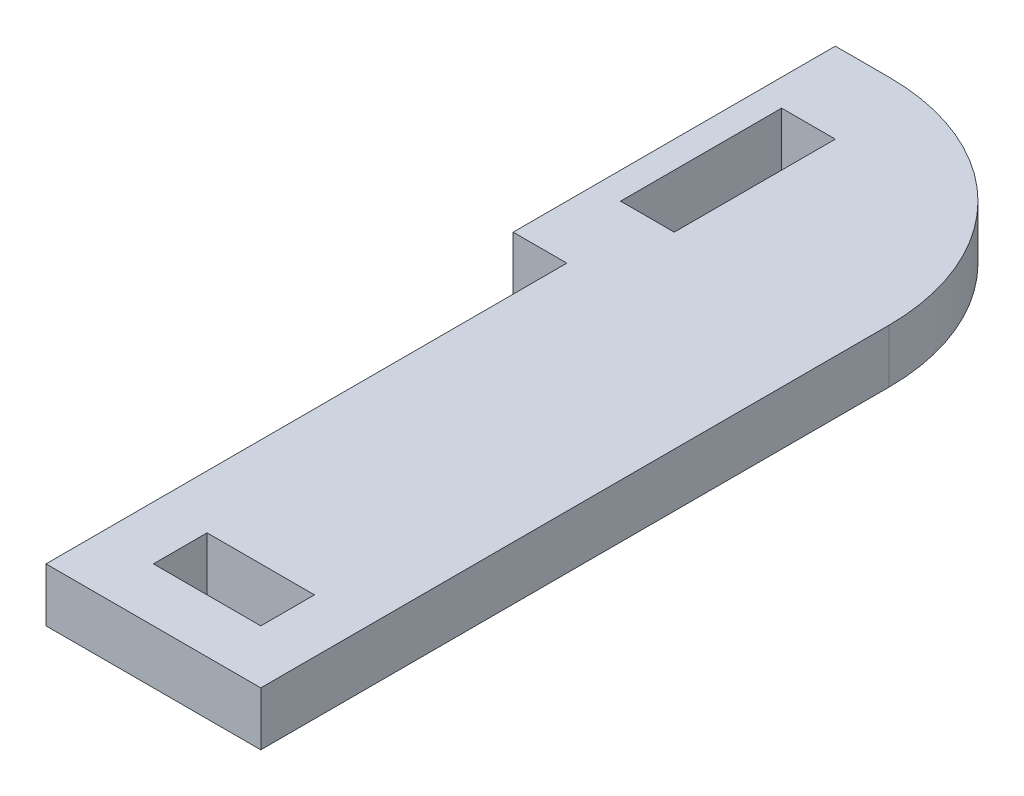
ISO-10303-21;
HEADER;
FILE_DESCRIPTION(('STEP AP214'),'2;1');
FILE_NAME('part.step','',(''),(''),'','','');
FILE_SCHEMA(('AUTOMOTIVE_DESIGN { 1 0 10303 214 1 1 1 1 }'));
ENDSEC;
DATA;
#1=APPLICATION_CONTEXT('core data for automotive mechanical design processes');
#2=APPLICATION_PROTOCOL_DEFINITION('international standard','automotive_design',2000,#1);
#3=PRODUCT_CONTEXT('',#1,'mechanical');
#4=PRODUCT('Part','Part','',(#3));
#5=PRODUCT_RELATED_PRODUCT_CATEGORY('part','',(#4));
#6=PRODUCT_DEFINITION_FORMATION('','',#4);
#7=PRODUCT_DEFINITION_CONTEXT('part definition',#1,'design');
#8=PRODUCT_DEFINITION('design','',#6,#7);
#9=PRODUCT_DEFINITION_SHAPE('','',#8);
#10=(LENGTH_UNIT() NAMED_UNIT(*) SI_UNIT(.MILLI.,.METRE.));
#11=(NAMED_UNIT(*) PLANE_ANGLE_UNIT() SI_UNIT($,.RADIAN.));
#12=(NAMED_UNIT(*) SI_UNIT($,.STERADIAN.) SOLID_ANGLE_UNIT());
#13=UNCERTAINTY_MEASURE_WITH_UNIT(LENGTH_MEASURE(1.E-05),#10,'distance_accuracy_value','');
#14=(GEOMETRIC_REPRESENTATION_CONTEXT(3) GLOBAL_UNCERTAINTY_ASSIGNED_CONTEXT((#13)) GLOBAL_UNIT_ASSIGNED_CONTEXT((#10,
#11,#12)) REPRESENTATION_CONTEXT('',''));
#15=CARTESIAN_POINT('',(0.,0.,0.));
#16=DIRECTION('',(0.,0.,1.));
#17=DIRECTION('',(1.,0.,0.));
#18=AXIS2_PLACEMENT_3D('',#15,#16,#17);
#19=CARTESIAN_POINT('',(0.,5.,0.));
#20=DIRECTION('',(0.,-1.,0.));
#21=DIRECTION('',(0.,0.,-1.));
#22=AXIS2_PLACEMENT_3D('',#19,#20,#21);
#23=PLANE('',#22);
#24=DIRECTION('',(0.,0.,1.));
#25=VECTOR('',#24,1.);
#26=CARTESIAN_POINT('',(-20.0645388891909,5.,-67.5272135511204));
#27=LINE('',#26,#25);
#28=CARTESIAN_POINT('',(-20.0645388891909,5.,-72.5272135511204));
#29=VERTEX_POINT('',#28);
#30=CARTESIAN_POINT('',(-20.0645388891909,5.,-67.5272135511204));
#31=VERTEX_POINT('',#30);
#32=EDGE_CURVE('E201',#29,#31,#27,.T.);
#33=ORIENTED_EDGE('',*,*,#32,.F.);
#34=DIRECTION('',(-1.,0.,0.));
#35=VECTOR('',#34,1.);
#36=CARTESIAN_POINT('',(-20.0645388891909,5.,-72.5272135511204));
#37=LINE('',#36,#35);
#38=CARTESIAN_POINT('',(-10.0645388891909,5.,-72.5272135511204));
#39=VERTEX_POINT('',#38);
#40=EDGE_CURVE('E212',#39,#29,#37,.T.);
#41=ORIENTED_EDGE('',*,*,#40,.F.);
#42=DIRECTION('',(0.,0.,-1.));
#43=VECTOR('',#42,1.);
#44=CARTESIAN_POINT('',(-10.0645388891909,5.,-67.5272135511204));
#45=LINE('',#44,#43);
#46=CARTESIAN_POINT('',(-10.0645388891909,5.,-67.5272135511204));
#47=VERTEX_POINT('',#46);
#48=EDGE_CURVE('E208',#47,#39,#45,.T.);
#49=ORIENTED_EDGE('',*,*,#48,.F.);
#50=DIRECTION('',(1.,0.,0.));
#51=VECTOR('',#50,1.);
#52=CARTESIAN_POINT('',(-20.0645388891909,5.,-67.5272135511204));
#53=LINE('',#52,#51);
#54=EDGE_CURVE('E204',#31,#47,#53,.T.);
#55=ORIENTED_EDGE('',*,*,#54,.F.);
#56=EDGE_LOOP('',(#33,#41,#49,#55));
#57=FACE_BOUND('',#56,.T.);
#58=DIRECTION('',(0.,0.,-1.));
#59=VECTOR('',#58,1.);
#60=CARTESIAN_POINT('',(-5.06453888919091,5.,-141.02721355112));
#61=LINE('',#60,#59);
#62=CARTESIAN_POINT('',(-5.06453888919092,5.,-62.5272135511204));
#63=VERTEX_POINT('',#62);
#64=CARTESIAN_POINT('',(-5.06453888919091,5.,-121.02721355112));
#65=VERTEX_POINT('',#64);
#66=EDGE_CURVE('E252',#63,#65,#61,.T.);
#67=ORIENTED_EDGE('',*,*,#66,.T.);
#68=CARTESIAN_POINT('',(-25.0645388891909,5.,-121.02721355112));
#69=DIRECTION('',(0.,-1.,0.));
#70=DIRECTION('',(0.,0.,-1.));
#71=AXIS2_PLACEMENT_3D('',#68,#69,#70);
#72=CIRCLE('',#71,20.);
#73=CARTESIAN_POINT('',(-25.0645388891909,5.,-141.02721355112));
#74=VERTEX_POINT('',#73);
#75=EDGE_CURVE('E11',#65,#74,#72,.F.);
#76=ORIENTED_EDGE('',*,*,#75,.T.);
#77=DIRECTION('',(-1.,0.,0.));
#78=VECTOR('',#77,1.);
#79=CARTESIAN_POINT('',(-30.0645388891909,5.,-141.02721355112));
#80=LINE('',#79,#78);
#81=CARTESIAN_POINT('',(-30.0645388891909,5.,-141.02721355112));
#82=VERTEX_POINT('',#81);
#83=EDGE_CURVE('E255',#74,#82,#80,.T.);
#84=ORIENTED_EDGE('',*,*,#83,.T.);
#85=DIRECTION('',(0.,0.,1.));
#86=VECTOR('',#85,1.);
#87=CARTESIAN_POINT('',(-30.0645388891909,5.,-111.02721355112));
#88=LINE('',#87,#86);
#89=CARTESIAN_POINT('',(-30.0645388891909,5.,-111.02721355112));
#90=VERTEX_POINT('',#89);
#91=EDGE_CURVE('E258',#82,#90,#88,.T.);
#92=ORIENTED_EDGE('',*,*,#91,.T.);
#93=DIRECTION('',(1.,0.,0.));
#94=VECTOR('',#93,1.);
#95=CARTESIAN_POINT('',(-30.0645388891909,5.,-111.02721355112));
#96=LINE('',#95,#94);
#97=CARTESIAN_POINT('',(-25.0645388891909,5.,-111.02721355112));
#98=VERTEX_POINT('',#97);
#99=EDGE_CURVE('E261',#90,#98,#96,.T.);
#100=ORIENTED_EDGE('',*,*,#99,.T.);
#101=DIRECTION('',(0.,0.,1.));
#102=VECTOR('',#101,1.);
#103=CARTESIAN_POINT('',(-25.0645388891909,5.,-62.5272135511204));
#104=LINE('',#103,#102);
#105=CARTESIAN_POINT('',(-25.0645388891909,5.,-62.5272135511204));
#106=VERTEX_POINT('',#105);
#107=EDGE_CURVE('E244',#98,#106,#104,.T.);
#108=ORIENTED_EDGE('',*,*,#107,.T.);
#109=DIRECTION('',(1.,0.,0.));
#110=VECTOR('',#109,1.);
#111=CARTESIAN_POINT('',(-25.0645388891909,5.,-62.5272135511204));
#112=LINE('',#111,#110);
#113=EDGE_CURVE('E248',#106,#63,#112,.T.);
#114=ORIENTED_EDGE('',*,*,#113,.T.);
#115=EDGE_LOOP('',(#67,#76,#84,#92,#100,#108,#114));
#116=FACE_BOUND('',#115,.T.);
#117=DIRECTION('',(0.,0.,-1.));
#118=VECTOR('',#117,1.);
#119=CARTESIAN_POINT('',(-22.5645388891909,5.,-118.52721355112));
#120=LINE('',#119,#118);
#121=CARTESIAN_POINT('',(-22.5645388891909,5.,-118.52721355112));
#122=VERTEX_POINT('',#121);
#123=CARTESIAN_POINT('',(-22.5645388891909,5.,-133.52721355112));
#124=VERTEX_POINT('',#123);
#125=EDGE_CURVE('E148',#122,#124,#120,.T.);
#126=ORIENTED_EDGE('',*,*,#125,.F.);
#127=DIRECTION('',(1.,0.,0.));
#128=VECTOR('',#127,1.);
#129=CARTESIAN_POINT('',(-27.5645388891909,5.,-118.52721355112));
#130=LINE('',#129,#128);
#131=CARTESIAN_POINT('',(-27.5645388891909,5.,-118.52721355112));
#132=VERTEX_POINT('',#131);
#133=EDGE_CURVE('E177',#132,#122,#130,.T.);
#134=ORIENTED_EDGE('',*,*,#133,.F.);
#135=DIRECTION('',(0.,0.,1.));
#136=VECTOR('',#135,1.);
#137=CARTESIAN_POINT('',(-27.5645388891909,5.,-118.52721355112));
#138=LINE('',#137,#136);
#139=CARTESIAN_POINT('',(-27.5645388891909,5.,-133.52721355112));
#140=VERTEX_POINT('',#139);
#141=EDGE_CURVE('E173',#140,#132,#138,.T.);
#142=ORIENTED_EDGE('',*,*,#141,.F.);
#143=DIRECTION('',(-1.,0.,0.));
#144=VECTOR('',#143,1.);
#145=CARTESIAN_POINT('',(-27.5645388891909,5.,-133.52721355112));
#146=LINE('',#145,#144);
#147=EDGE_CURVE('E159',#124,#140,#146,.T.);
#148=ORIENTED_EDGE('',*,*,#147,.F.);
#149=EDGE_LOOP('',(#126,#134,#142,#148));
#150=FACE_BOUND('',#149,.T.);
#151=ADVANCED_FACE('F39',(#57,#116,#150),#23,.F.);
#152=CARTESIAN_POINT('',(0.,0.,0.));
#153=DIRECTION('',(0.,-1.,0.));
#154=DIRECTION('',(0.,0.,-1.));
#155=AXIS2_PLACEMENT_3D('',#152,#153,#154);
#156=PLANE('',#155);
#157=DIRECTION('',(-1.,0.,0.));
#158=VECTOR('',#157,1.);
#159=CARTESIAN_POINT('',(-30.0645388891909,0.,-141.02721355112));
#160=LINE('',#159,#158);
#161=CARTESIAN_POINT('',(-25.0645388891909,0.,-141.02721355112));
#162=VERTEX_POINT('',#161);
#163=CARTESIAN_POINT('',(-30.0645388891909,0.,-141.02721355112));
#164=VERTEX_POINT('',#163);
#165=EDGE_CURVE('E274',#162,#164,#160,.T.);
#166=ORIENTED_EDGE('',*,*,#165,.F.);
#167=CARTESIAN_POINT('',(-25.0645388891909,0.,-121.02721355112));
#168=DIRECTION('',(0.,-1.,0.));
#169=DIRECTION('',(0.,0.,-1.));
#170=AXIS2_PLACEMENT_3D('',#167,#168,#169);
#171=CIRCLE('',#170,20.);
#172=CARTESIAN_POINT('',(-5.06453888919091,0.,-121.02721355112));
#173=VERTEX_POINT('',#172);
#174=EDGE_CURVE('E62',#162,#173,#171,.T.);
#175=ORIENTED_EDGE('',*,*,#174,.T.);
#176=DIRECTION('',(0.,0.,-1.));
#177=VECTOR('',#176,1.);
#178=CARTESIAN_POINT('',(-5.06453888919091,0.,-141.02721355112));
#179=LINE('',#178,#177);
#180=CARTESIAN_POINT('',(-5.06453888919092,0.,-62.5272135511204));
#181=VERTEX_POINT('',#180);
#182=EDGE_CURVE('E271',#181,#173,#179,.T.);
#183=ORIENTED_EDGE('',*,*,#182,.F.);
#184=DIRECTION('',(1.,0.,0.));
#185=VECTOR('',#184,1.);
#186=CARTESIAN_POINT('',(-25.0645388891909,0.,-62.5272135511204));
#187=LINE('',#186,#185);
#188=CARTESIAN_POINT('',(-25.0645388891909,0.,-62.5272135511204));
#189=VERTEX_POINT('',#188);
#190=EDGE_CURVE('E268',#189,#181,#187,.T.);
#191=ORIENTED_EDGE('',*,*,#190,.F.);
#192=DIRECTION('',(0.,0.,1.));
#193=VECTOR('',#192,1.);
#194=CARTESIAN_POINT('',(-25.0645388891909,0.,-62.5272135511204));
#195=LINE('',#194,#193);
#196=CARTESIAN_POINT('',(-25.0645388891909,0.,-111.02721355112));
#197=VERTEX_POINT('',#196);
#198=EDGE_CURVE('E243',#197,#189,#195,.T.);
#199=ORIENTED_EDGE('',*,*,#198,.F.);
#200=DIRECTION('',(1.,0.,0.));
#201=VECTOR('',#200,1.);
#202=CARTESIAN_POINT('',(-30.0645388891909,0.,-111.02721355112));
#203=LINE('',#202,#201);
#204=CARTESIAN_POINT('',(-30.0645388891909,0.,-111.02721355112));
#205=VERTEX_POINT('',#204);
#206=EDGE_CURVE('E249',#205,#197,#203,.T.);
#207=ORIENTED_EDGE('',*,*,#206,.F.);
#208=DIRECTION('',(0.,0.,1.));
#209=VECTOR('',#208,1.);
#210=CARTESIAN_POINT('',(-30.0645388891909,0.,-111.02721355112));
#211=LINE('',#210,#209);
#212=EDGE_CURVE('E277',#164,#205,#211,.T.);
#213=ORIENTED_EDGE('',*,*,#212,.F.);
#214=EDGE_LOOP('',(#166,#175,#183,#191,#199,#207,#213));
#215=FACE_BOUND('',#214,.T.);
#216=DIRECTION('',(-1.,0.,0.));
#217=VECTOR('',#216,1.);
#218=CARTESIAN_POINT('',(-20.0645388891909,0.,-72.5272135511204));
#219=LINE('',#218,#217);
#220=CARTESIAN_POINT('',(-10.0645388891909,0.,-72.5272135511204));
#221=VERTEX_POINT('',#220);
#222=CARTESIAN_POINT('',(-20.0645388891909,0.,-72.5272135511204));
#223=VERTEX_POINT('',#222);
#224=EDGE_CURVE('E205',#221,#223,#219,.T.);
#225=ORIENTED_EDGE('',*,*,#224,.T.);
#226=DIRECTION('',(0.,0.,1.));
#227=VECTOR('',#226,1.);
#228=CARTESIAN_POINT('',(-20.0645388891909,0.,-67.5272135511204));
#229=LINE('',#228,#227);
#230=CARTESIAN_POINT('',(-20.0645388891909,0.,-67.5272135511204));
#231=VERTEX_POINT('',#230);
#232=EDGE_CURVE('E168',#223,#231,#229,.T.);
#233=ORIENTED_EDGE('',*,*,#232,.T.);
#234=DIRECTION('',(1.,0.,0.));
#235=VECTOR('',#234,1.);
#236=CARTESIAN_POINT('',(-20.0645388891909,0.,-67.5272135511204));
#237=LINE('',#236,#235);
#238=CARTESIAN_POINT('',(-10.0645388891909,0.,-67.5272135511204));
#239=VERTEX_POINT('',#238);
#240=EDGE_CURVE('E219',#231,#239,#237,.T.);
#241=ORIENTED_EDGE('',*,*,#240,.T.);
#242=DIRECTION('',(0.,0.,-1.));
#243=VECTOR('',#242,1.);
#244=CARTESIAN_POINT('',(-10.0645388891909,0.,-67.5272135511204));
#245=LINE('',#244,#243);
#246=EDGE_CURVE('E223',#239,#221,#245,.T.);
#247=ORIENTED_EDGE('',*,*,#246,.T.);
#248=EDGE_LOOP('',(#225,#233,#241,#247));
#249=FACE_BOUND('',#248,.T.);
#250=DIRECTION('',(1.,0.,0.));
#251=VECTOR('',#250,1.);
#252=CARTESIAN_POINT('',(-27.5645388891909,0.,-118.52721355112));
#253=LINE('',#252,#251);
#254=CARTESIAN_POINT('',(-27.5645388891909,0.,-118.52721355112));
#255=VERTEX_POINT('',#254);
#256=CARTESIAN_POINT('',(-22.5645388891909,0.,-118.52721355112));
#257=VERTEX_POINT('',#256);
#258=EDGE_CURVE('E160',#255,#257,#253,.T.);
#259=ORIENTED_EDGE('',*,*,#258,.T.);
#260=DIRECTION('',(0.,0.,-1.));
#261=VECTOR('',#260,1.);
#262=CARTESIAN_POINT('',(-22.5645388891909,0.,-118.52721355112));
#263=LINE('',#262,#261);
#264=CARTESIAN_POINT('',(-22.5645388891909,0.,-133.52721355112));
#265=VERTEX_POINT('',#264);
#266=EDGE_CURVE('E182',#257,#265,#263,.T.);
#267=ORIENTED_EDGE('',*,*,#266,.T.);
#268=DIRECTION('',(-1.,0.,0.));
#269=VECTOR('',#268,1.);
#270=CARTESIAN_POINT('',(-27.5645388891909,0.,-133.52721355112));
#271=LINE('',#270,#269);
#272=CARTESIAN_POINT('',(-27.5645388891909,0.,-133.52721355112));
#273=VERTEX_POINT('',#272);
#274=EDGE_CURVE('E166',#265,#273,#271,.T.);
#275=ORIENTED_EDGE('',*,*,#274,.T.);
#276=DIRECTION('',(0.,0.,1.));
#277=VECTOR('',#276,1.);
#278=CARTESIAN_POINT('',(-27.5645388891909,0.,-118.52721355112));
#279=LINE('',#278,#277);
#280=EDGE_CURVE('E187',#273,#255,#279,.T.);
#281=ORIENTED_EDGE('',*,*,#280,.T.);
#282=EDGE_LOOP('',(#259,#267,#275,#281));
#283=FACE_BOUND('',#282,.T.);
#284=ADVANCED_FACE('F315',(#215,#249,#283),#156,.T.);
#285=CARTESIAN_POINT('',(-25.0645388891909,5.,-62.5272135511204));
#286=DIRECTION('',(1.,0.,0.));
#287=DIRECTION('',(0.,0.,-1.));
#288=AXIS2_PLACEMENT_3D('',#285,#286,#287);
#289=PLANE('',#288);
#290=ORIENTED_EDGE('',*,*,#198,.T.);
#291=DIRECTION('',(0.,-1.,0.));
#292=VECTOR('',#291,1.);
#293=CARTESIAN_POINT('',(-25.0645388891909,5.,-62.5272135511204));
#294=LINE('',#293,#292);
#295=EDGE_CURVE('E297',#106,#189,#294,.T.);
#296=ORIENTED_EDGE('',*,*,#295,.F.);
#297=ORIENTED_EDGE('',*,*,#107,.F.);
#298=DIRECTION('',(0.,-1.,0.));
#299=VECTOR('',#298,1.);
#300=CARTESIAN_POINT('',(-25.0645388891909,5.,-111.02721355112));
#301=LINE('',#300,#299);
#302=EDGE_CURVE('E264',#98,#197,#301,.T.);
#303=ORIENTED_EDGE('',*,*,#302,.T.);
#304=EDGE_LOOP('',(#290,#296,#297,#303));
#305=FACE_BOUND('',#304,.T.);
#306=ADVANCED_FACE('F344',(#305),#289,.F.);
#307=CARTESIAN_POINT('',(-25.0645388891909,5.,-62.5272135511204));
#308=DIRECTION('',(0.,0.,-1.));
#309=DIRECTION('',(-1.,0.,0.));
#310=AXIS2_PLACEMENT_3D('',#307,#308,#309);
#311=PLANE('',#310);
#312=ORIENTED_EDGE('',*,*,#190,.T.);
#313=DIRECTION('',(0.,-1.,0.));
#314=VECTOR('',#313,1.);
#315=CARTESIAN_POINT('',(-5.06453888919092,5.,-62.5272135511204));
#316=LINE('',#315,#314);
#317=EDGE_CURVE('E293',#63,#181,#316,.T.);
#318=ORIENTED_EDGE('',*,*,#317,.F.);
#319=ORIENTED_EDGE('',*,*,#113,.F.);
#320=ORIENTED_EDGE('',*,*,#295,.T.);
#321=EDGE_LOOP('',(#312,#318,#319,#320));
#322=FACE_BOUND('',#321,.T.);
#323=ADVANCED_FACE('F360',(#322),#311,.F.);
#324=CARTESIAN_POINT('',(-5.06453888919091,5.,-141.02721355112));
#325=DIRECTION('',(-1.,0.,0.));
#326=DIRECTION('',(0.,0.,1.));
#327=AXIS2_PLACEMENT_3D('',#324,#325,#326);
#328=PLANE('',#327);
#329=ORIENTED_EDGE('',*,*,#182,.T.);
#330=DIRECTION('',(0.,-1.,0.));
#331=VECTOR('',#330,1.);
#332=CARTESIAN_POINT('',(-5.06453888919091,5.,-121.02721355112));
#333=LINE('',#332,#331);
#334=EDGE_CURVE('E48',#173,#65,#333,.F.);
#335=ORIENTED_EDGE('',*,*,#334,.T.);
#336=ORIENTED_EDGE('',*,*,#66,.F.);
#337=ORIENTED_EDGE('',*,*,#317,.T.);
#338=EDGE_LOOP('',(#329,#335,#336,#337));
#339=FACE_BOUND('',#338,.T.);
#340=ADVANCED_FACE('F357',(#339),#328,.F.);
#341=CARTESIAN_POINT('',(-30.0645388891909,5.,-141.02721355112));
#342=DIRECTION('',(0.,0.,1.));
#343=DIRECTION('',(1.,0.,0.));
#344=AXIS2_PLACEMENT_3D('',#341,#342,#343);
#345=PLANE('',#344);
#346=ORIENTED_EDGE('',*,*,#83,.F.);
#347=DIRECTION('',(0.,-1.,0.));
#348=VECTOR('',#347,1.);
#349=CARTESIAN_POINT('',(-25.0645388891909,5.,-141.02721355112));
#350=LINE('',#349,#348);
#351=EDGE_CURVE('E301',#74,#162,#350,.T.);
#352=ORIENTED_EDGE('',*,*,#351,.T.);
#353=ORIENTED_EDGE('',*,*,#165,.T.);
#354=DIRECTION('',(0.,-1.,0.));
#355=VECTOR('',#354,1.);
#356=CARTESIAN_POINT('',(-30.0645388891909,5.,-141.02721355112));
#357=LINE('',#356,#355);
#358=EDGE_CURVE('E289',#82,#164,#357,.T.);
#359=ORIENTED_EDGE('',*,*,#358,.F.);
#360=EDGE_LOOP('',(#346,#352,#353,#359));
#361=FACE_BOUND('',#360,.T.);
#362=ADVANCED_FACE('F310',(#361),#345,.F.);
#363=CARTESIAN_POINT('',(-30.0645388891909,5.,-111.02721355112));
#364=DIRECTION('',(1.,0.,0.));
#365=DIRECTION('',(0.,0.,-1.));
#366=AXIS2_PLACEMENT_3D('',#363,#364,#365);
#367=PLANE('',#366);
#368=ORIENTED_EDGE('',*,*,#212,.T.);
#369=DIRECTION('',(0.,-1.,0.));
#370=VECTOR('',#369,1.);
#371=CARTESIAN_POINT('',(-30.0645388891909,5.,-111.02721355112));
#372=LINE('',#371,#370);
#373=EDGE_CURVE('E285',#90,#205,#372,.T.);
#374=ORIENTED_EDGE('',*,*,#373,.F.);
#375=ORIENTED_EDGE('',*,*,#91,.F.);
#376=ORIENTED_EDGE('',*,*,#358,.T.);
#377=EDGE_LOOP('',(#368,#374,#375,#376));
#378=FACE_BOUND('',#377,.T.);
#379=ADVANCED_FACE('F321',(#378),#367,.F.);
#380=CARTESIAN_POINT('',(-30.0645388891909,5.,-111.02721355112));
#381=DIRECTION('',(0.,0.,-1.));
#382=DIRECTION('',(-1.,0.,0.));
#383=AXIS2_PLACEMENT_3D('',#380,#381,#382);
#384=PLANE('',#383);
#385=ORIENTED_EDGE('',*,*,#206,.T.);
#386=ORIENTED_EDGE('',*,*,#302,.F.);
#387=ORIENTED_EDGE('',*,*,#99,.F.);
#388=ORIENTED_EDGE('',*,*,#373,.T.);
#389=EDGE_LOOP('',(#385,#386,#387,#388));
#390=FACE_BOUND('',#389,.T.);
#391=ADVANCED_FACE('F325',(#390),#384,.F.);
#392=CARTESIAN_POINT('',(-20.0645388891909,5.,-67.5272135511204));
#393=DIRECTION('',(1.,0.,0.));
#394=DIRECTION('',(0.,0.,-1.));
#395=AXIS2_PLACEMENT_3D('',#392,#393,#394);
#396=PLANE('',#395);
#397=ORIENTED_EDGE('',*,*,#232,.F.);
#398=DIRECTION('',(0.,-1.,0.));
#399=VECTOR('',#398,1.);
#400=CARTESIAN_POINT('',(-20.0645388891909,5.,-72.5272135511204));
#401=LINE('',#400,#399);
#402=EDGE_CURVE('E215',#29,#223,#401,.T.);
#403=ORIENTED_EDGE('',*,*,#402,.F.);
#404=ORIENTED_EDGE('',*,*,#32,.T.);
#405=DIRECTION('',(0.,-1.,0.));
#406=VECTOR('',#405,1.);
#407=CARTESIAN_POINT('',(-20.0645388891909,5.,-67.5272135511204));
#408=LINE('',#407,#406);
#409=EDGE_CURVE('E239',#31,#231,#408,.T.);
#410=ORIENTED_EDGE('',*,*,#409,.T.);
#411=EDGE_LOOP('',(#397,#403,#404,#410));
#412=FACE_BOUND('',#411,.T.);
#413=ADVANCED_FACE('F348',(#412),#396,.T.);
#414=CARTESIAN_POINT('',(-20.0645388891909,5.,-67.5272135511204));
#415=DIRECTION('',(0.,0.,-1.));
#416=DIRECTION('',(-1.,0.,0.));
#417=AXIS2_PLACEMENT_3D('',#414,#415,#416);
#418=PLANE('',#417);
#419=ORIENTED_EDGE('',*,*,#240,.F.);
#420=ORIENTED_EDGE('',*,*,#409,.F.);
#421=ORIENTED_EDGE('',*,*,#54,.T.);
#422=DIRECTION('',(0.,-1.,0.));
#423=VECTOR('',#422,1.);
#424=CARTESIAN_POINT('',(-10.0645388891909,5.,-67.5272135511204));
#425=LINE('',#424,#423);
#426=EDGE_CURVE('E236',#47,#239,#425,.T.);
#427=ORIENTED_EDGE('',*,*,#426,.T.);
#428=EDGE_LOOP('',(#419,#420,#421,#427));
#429=FACE_BOUND('',#428,.T.);
#430=ADVANCED_FACE('F396',(#429),#418,.T.);
#431=CARTESIAN_POINT('',(-10.0645388891909,5.,-67.5272135511204));
#432=DIRECTION('',(-1.,0.,0.));
#433=DIRECTION('',(0.,0.,1.));
#434=AXIS2_PLACEMENT_3D('',#431,#432,#433);
#435=PLANE('',#434);
#436=ORIENTED_EDGE('',*,*,#246,.F.);
#437=ORIENTED_EDGE('',*,*,#426,.F.);
#438=ORIENTED_EDGE('',*,*,#48,.T.);
#439=DIRECTION('',(0.,-1.,0.));
#440=VECTOR('',#439,1.);
#441=CARTESIAN_POINT('',(-10.0645388891909,5.,-72.5272135511204));
#442=LINE('',#441,#440);
#443=EDGE_CURVE('E233',#39,#221,#442,.T.);
#444=ORIENTED_EDGE('',*,*,#443,.T.);
#445=EDGE_LOOP('',(#436,#437,#438,#444));
#446=FACE_BOUND('',#445,.T.);
#447=ADVANCED_FACE('F403',(#446),#435,.T.);
#448=CARTESIAN_POINT('',(-20.0645388891909,5.,-72.5272135511204));
#449=DIRECTION('',(0.,0.,1.));
#450=DIRECTION('',(1.,0.,0.));
#451=AXIS2_PLACEMENT_3D('',#448,#449,#450);
#452=PLANE('',#451);
#453=ORIENTED_EDGE('',*,*,#224,.F.);
#454=ORIENTED_EDGE('',*,*,#443,.F.);
#455=ORIENTED_EDGE('',*,*,#40,.T.);
#456=ORIENTED_EDGE('',*,*,#402,.T.);
#457=EDGE_LOOP('',(#453,#454,#455,#456));
#458=FACE_BOUND('',#457,.T.);
#459=ADVANCED_FACE('F410',(#458),#452,.T.);
#460=CARTESIAN_POINT('',(-22.5645388891909,5.,-118.52721355112));
#461=DIRECTION('',(-1.,0.,0.));
#462=DIRECTION('',(0.,0.,1.));
#463=AXIS2_PLACEMENT_3D('',#460,#461,#462);
#464=PLANE('',#463);
#465=ORIENTED_EDGE('',*,*,#266,.F.);
#466=DIRECTION('',(0.,-1.,0.));
#467=VECTOR('',#466,1.);
#468=CARTESIAN_POINT('',(-22.5645388891909,5.,-118.52721355112));
#469=LINE('',#468,#467);
#470=EDGE_CURVE('E154',#122,#257,#469,.T.);
#471=ORIENTED_EDGE('',*,*,#470,.F.);
#472=ORIENTED_EDGE('',*,*,#125,.T.);
#473=DIRECTION('',(0.,-1.,0.));
#474=VECTOR('',#473,1.);
#475=CARTESIAN_POINT('',(-22.5645388891909,5.,-133.52721355112));
#476=LINE('',#475,#474);
#477=EDGE_CURVE('E151',#124,#265,#476,.T.);
#478=ORIENTED_EDGE('',*,*,#477,.T.);
#479=EDGE_LOOP('',(#465,#471,#472,#478));
#480=FACE_BOUND('',#479,.T.);
#481=ADVANCED_FACE('F150',(#480),#464,.T.);
#482=CARTESIAN_POINT('',(-27.5645388891909,5.,-133.52721355112));
#483=DIRECTION('',(0.,0.,1.));
#484=DIRECTION('',(1.,0.,0.));
#485=AXIS2_PLACEMENT_3D('',#482,#483,#484);
#486=PLANE('',#485);
#487=ORIENTED_EDGE('',*,*,#274,.F.);
#488=ORIENTED_EDGE('',*,*,#477,.F.);
#489=ORIENTED_EDGE('',*,*,#147,.T.);
#490=DIRECTION('',(0.,-1.,0.));
#491=VECTOR('',#490,1.);
#492=CARTESIAN_POINT('',(-27.5645388891909,5.,-133.52721355112));
#493=LINE('',#492,#491);
#494=EDGE_CURVE('E169',#140,#273,#493,.T.);
#495=ORIENTED_EDGE('',*,*,#494,.T.);
#496=EDGE_LOOP('',(#487,#488,#489,#495));
#497=FACE_BOUND('',#496,.T.);
#498=ADVANCED_FACE('F163',(#497),#486,.T.);
#499=CARTESIAN_POINT('',(-27.5645388891909,5.,-118.52721355112));
#500=DIRECTION('',(1.,0.,0.));
#501=DIRECTION('',(0.,0.,-1.));
#502=AXIS2_PLACEMENT_3D('',#499,#500,#501);
#503=PLANE('',#502);
#504=ORIENTED_EDGE('',*,*,#280,.F.);
#505=ORIENTED_EDGE('',*,*,#494,.F.);
#506=ORIENTED_EDGE('',*,*,#141,.T.);
#507=DIRECTION('',(0.,-1.,0.));
#508=VECTOR('',#507,1.);
#509=CARTESIAN_POINT('',(-27.5645388891909,5.,-118.52721355112));
#510=LINE('',#509,#508);
#511=EDGE_CURVE('E196',#132,#255,#510,.T.);
#512=ORIENTED_EDGE('',*,*,#511,.T.);
#513=EDGE_LOOP('',(#504,#505,#506,#512));
#514=FACE_BOUND('',#513,.T.);
#515=ADVANCED_FACE('F335',(#514),#503,.T.);
#516=CARTESIAN_POINT('',(-27.5645388891909,5.,-118.52721355112));
#517=DIRECTION('',(0.,0.,-1.));
#518=DIRECTION('',(-1.,0.,0.));
#519=AXIS2_PLACEMENT_3D('',#516,#517,#518);
#520=PLANE('',#519);
#521=ORIENTED_EDGE('',*,*,#258,.F.);
#522=ORIENTED_EDGE('',*,*,#511,.F.);
#523=ORIENTED_EDGE('',*,*,#133,.T.);
#524=ORIENTED_EDGE('',*,*,#470,.T.);
#525=EDGE_LOOP('',(#521,#522,#523,#524));
#526=FACE_BOUND('',#525,.T.);
#527=ADVANCED_FACE('F331',(#526),#520,.T.);
#528=CARTESIAN_POINT('',(-25.0645388891909,5.,-121.02721355112));
#529=DIRECTION('',(0.,-1.,0.));
#530=DIRECTION('',(0.,0.,-1.));
#531=AXIS2_PLACEMENT_3D('',#528,#529,#530);
#532=CYLINDRICAL_SURFACE('',#531,20.);
#533=ORIENTED_EDGE('',*,*,#75,.F.);
#534=ORIENTED_EDGE('',*,*,#334,.F.);
#535=ORIENTED_EDGE('',*,*,#174,.F.);
#536=ORIENTED_EDGE('',*,*,#351,.F.);
#537=EDGE_LOOP('',(#533,#534,#535,#536));
#538=FACE_BOUND('',#537,.T.);
#539=ADVANCED_FACE('F41',(#538),#532,.T.);
#540=CLOSED_SHELL('',(#151,#284,#306,#323,#340,#362,#379,#391,#413,#430,#447,#459,#481,#498,
#515,#527,#539));
#541=MANIFOLD_SOLID_BREP('B2',#540);
#542=ADVANCED_BREP_SHAPE_REPRESENTATION('',(#18,#541),#14);
#543=SHAPE_DEFINITION_REPRESENTATION(#9,#542);
ENDSEC;
END-ISO-10303-21;
